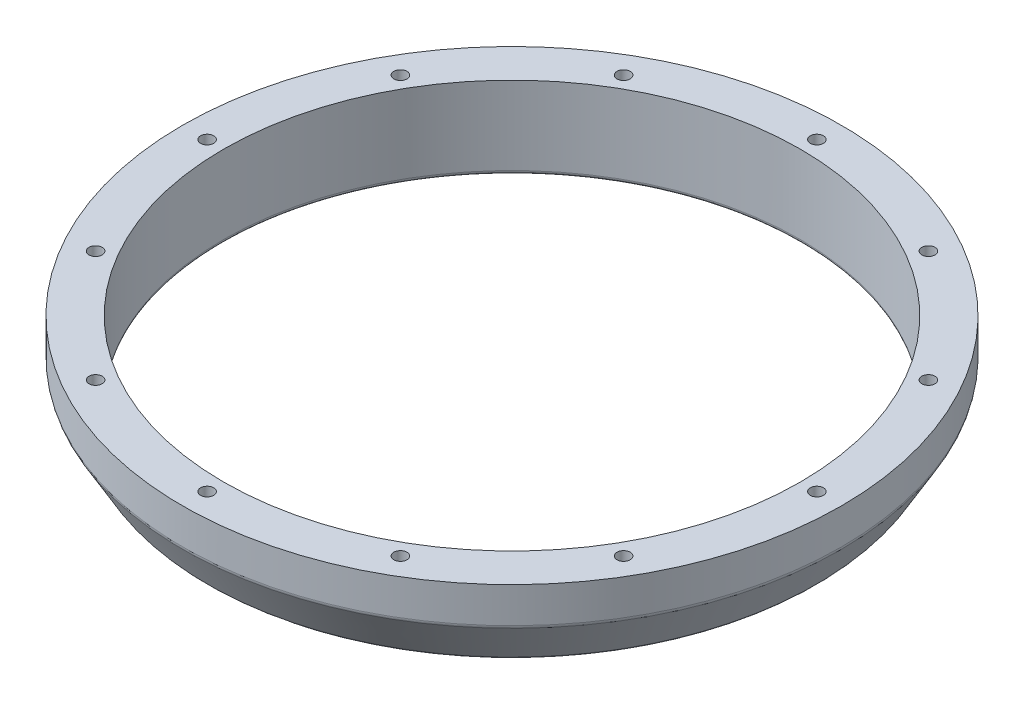
ISO-10303-21;
HEADER;
FILE_DESCRIPTION(('STEP AP214'),'2;1');
FILE_NAME('part.step','',(''),(''),'','','');
FILE_SCHEMA(('AUTOMOTIVE_DESIGN { 1 0 10303 214 1 1 1 1 }'));
ENDSEC;
DATA;
#1=APPLICATION_CONTEXT('core data for automotive mechanical design processes');
#2=APPLICATION_PROTOCOL_DEFINITION('international standard','automotive_design',2000,#1);
#3=PRODUCT_CONTEXT('',#1,'mechanical');
#4=PRODUCT('Part','Part','',(#3));
#5=PRODUCT_RELATED_PRODUCT_CATEGORY('part','',(#4));
#6=PRODUCT_DEFINITION_FORMATION('','',#4);
#7=PRODUCT_DEFINITION_CONTEXT('part definition',#1,'design');
#8=PRODUCT_DEFINITION('design','',#6,#7);
#9=PRODUCT_DEFINITION_SHAPE('','',#8);
#10=(LENGTH_UNIT() NAMED_UNIT(*) SI_UNIT(.MILLI.,.METRE.));
#11=(NAMED_UNIT(*) PLANE_ANGLE_UNIT() SI_UNIT($,.RADIAN.));
#12=(NAMED_UNIT(*) SI_UNIT($,.STERADIAN.) SOLID_ANGLE_UNIT());
#13=UNCERTAINTY_MEASURE_WITH_UNIT(LENGTH_MEASURE(1.E-05),#10,'distance_accuracy_value','');
#14=(GEOMETRIC_REPRESENTATION_CONTEXT(3) GLOBAL_UNCERTAINTY_ASSIGNED_CONTEXT((#13)) GLOBAL_UNIT_ASSIGNED_CONTEXT((#10,
#11,#12)) REPRESENTATION_CONTEXT('',''));
#15=CARTESIAN_POINT('',(0.,0.,0.));
#16=DIRECTION('',(0.,0.,1.));
#17=DIRECTION('',(1.,0.,0.));
#18=AXIS2_PLACEMENT_3D('',#15,#16,#17);
#19=CARTESIAN_POINT('',(-32.04293994002,5.275447721999,-18.5));
#20=DIRECTION('',(0.,1.,0.));
#21=DIRECTION('',(1.,0.,0.));
#22=AXIS2_PLACEMENT_3D('',#19,#20,#21);
#23=CONICAL_SURFACE('',#22,0.458421992183,1.02974425867665);
#24=DIRECTION('',(-0.857167300702112,0.515038074910054,0.));
#25=VECTOR('',#24,1.);
#26=CARTESIAN_POINT('',(-32.501361932203,5.275447721999,-18.5));
#27=LINE('',#26,#25);
#28=CARTESIAN_POINT('',(-32.04293994002,5.,-18.5));
#29=VERTEX_POINT('',#28);
#30=CARTESIAN_POINT('',(-32.84293994002,5.480688495222,-18.5));
#31=VERTEX_POINT('',#30);
#32=EDGE_CURVE('E11',#29,#31,#27,.T.);
#33=ORIENTED_EDGE('',*,*,#32,.T.);
#34=CARTESIAN_POINT('',(-32.04293994002,5.480688495222,-18.5));
#35=DIRECTION('',(0.,1.,0.));
#36=DIRECTION('',(1.,0.,0.));
#37=AXIS2_PLACEMENT_3D('',#34,#35,#36);
#38=CIRCLE('',#37,0.8);
#39=EDGE_CURVE('E316',#31,#31,#38,.T.);
#40=ORIENTED_EDGE('',*,*,#39,.T.);
#41=ORIENTED_EDGE('',*,*,#32,.F.);
#42=EDGE_LOOP('',(#33,#40,#41));
#43=FACE_BOUND('',#42,.T.);
#44=ADVANCED_FACE('F17',(#43),#23,.F.);
#45=CARTESIAN_POINT('',(-32.04293994002,4.75,-18.5));
#46=DIRECTION('',(0.,1.,0.));
#47=DIRECTION('',(1.,0.,0.));
#48=AXIS2_PLACEMENT_3D('',#45,#46,#47);
#49=CYLINDRICAL_SURFACE('',#48,0.8);
#50=ORIENTED_EDGE('',*,*,#39,.F.);
#51=DIRECTION('',(0.,1.,0.));
#52=VECTOR('',#51,1.);
#53=CARTESIAN_POINT('',(-32.84293994002,4.75,-18.5));
#54=LINE('',#53,#52);
#55=CARTESIAN_POINT('',(-32.84293994002,10.,-18.5));
#56=VERTEX_POINT('',#55);
#57=EDGE_CURVE('E28',#31,#56,#54,.T.);
#58=ORIENTED_EDGE('',*,*,#57,.T.);
#59=CARTESIAN_POINT('',(-32.04293994002,10.,-18.5));
#60=DIRECTION('',(0.,1.,0.));
#61=DIRECTION('',(1.,0.,0.));
#62=AXIS2_PLACEMENT_3D('',#59,#60,#61);
#63=CIRCLE('',#62,0.8);
#64=EDGE_CURVE('E21',#56,#56,#63,.T.);
#65=ORIENTED_EDGE('',*,*,#64,.T.);
#66=ORIENTED_EDGE('',*,*,#57,.F.);
#67=EDGE_LOOP('',(#50,#58,#65,#66));
#68=FACE_BOUND('',#67,.T.);
#69=ADVANCED_FACE('F383',(#68),#49,.F.);
#70=CARTESIAN_POINT('',(-18.5,5.275447721999,-32.04293994002));
#71=DIRECTION('',(0.,1.,0.));
#72=DIRECTION('',(1.,0.,0.));
#73=AXIS2_PLACEMENT_3D('',#70,#71,#72);
#74=CONICAL_SURFACE('',#73,0.458421992183,1.02974425867665);
#75=DIRECTION('',(-0.857167300702112,0.515038074910054,0.));
#76=VECTOR('',#75,1.);
#77=CARTESIAN_POINT('',(-18.958421992183,5.275447721999,-32.04293994002));
#78=LINE('',#77,#76);
#79=CARTESIAN_POINT('',(-18.5,5.,-32.04293994002));
#80=VERTEX_POINT('',#79);
#81=CARTESIAN_POINT('',(-19.3,5.480688495222,-32.04293994002));
#82=VERTEX_POINT('',#81);
#83=EDGE_CURVE('E313',#80,#82,#78,.T.);
#84=ORIENTED_EDGE('',*,*,#83,.T.);
#85=CARTESIAN_POINT('',(-18.5,5.480688495222,-32.04293994002));
#86=DIRECTION('',(0.,1.,0.));
#87=DIRECTION('',(1.,0.,0.));
#88=AXIS2_PLACEMENT_3D('',#85,#86,#87);
#89=CIRCLE('',#88,0.8);
#90=EDGE_CURVE('E359',#82,#82,#89,.T.);
#91=ORIENTED_EDGE('',*,*,#90,.T.);
#92=ORIENTED_EDGE('',*,*,#83,.F.);
#93=EDGE_LOOP('',(#84,#91,#92));
#94=FACE_BOUND('',#93,.T.);
#95=ADVANCED_FACE('F482',(#94),#74,.F.);
#96=CARTESIAN_POINT('',(-18.5,4.75,-32.04293994002));
#97=DIRECTION('',(0.,1.,0.));
#98=DIRECTION('',(1.,0.,0.));
#99=AXIS2_PLACEMENT_3D('',#96,#97,#98);
#100=CYLINDRICAL_SURFACE('',#99,0.8);
#101=ORIENTED_EDGE('',*,*,#90,.F.);
#102=DIRECTION('',(0.,1.,0.));
#103=VECTOR('',#102,1.);
#104=CARTESIAN_POINT('',(-19.3,4.75,-32.04293994002));
#105=LINE('',#104,#103);
#106=CARTESIAN_POINT('',(-19.3,10.,-32.04293994002));
#107=VERTEX_POINT('',#106);
#108=EDGE_CURVE('E317',#82,#107,#105,.T.);
#109=ORIENTED_EDGE('',*,*,#108,.T.);
#110=CARTESIAN_POINT('',(-18.5,10.,-32.04293994002));
#111=DIRECTION('',(0.,1.,0.));
#112=DIRECTION('',(1.,0.,0.));
#113=AXIS2_PLACEMENT_3D('',#110,#111,#112);
#114=CIRCLE('',#113,0.8);
#115=EDGE_CURVE('E318',#107,#107,#114,.T.);
#116=ORIENTED_EDGE('',*,*,#115,.T.);
#117=ORIENTED_EDGE('',*,*,#108,.F.);
#118=EDGE_LOOP('',(#101,#109,#116,#117));
#119=FACE_BOUND('',#118,.T.);
#120=ADVANCED_FACE('F545',(#119),#100,.F.);
#121=CARTESIAN_POINT('',(0.,5.275447721999,-37.));
#122=DIRECTION('',(0.,1.,0.));
#123=DIRECTION('',(1.,0.,0.));
#124=AXIS2_PLACEMENT_3D('',#121,#122,#123);
#125=CONICAL_SURFACE('',#124,0.458421992183,1.02974425867665);
#126=DIRECTION('',(-0.857167300702112,0.515038074910054,0.));
#127=VECTOR('',#126,1.);
#128=CARTESIAN_POINT('',(-0.458421992183,5.275447721999,-37.));
#129=LINE('',#128,#127);
#130=CARTESIAN_POINT('',(0.,5.,-37.));
#131=VERTEX_POINT('',#130);
#132=CARTESIAN_POINT('',(-0.8,5.480688495222,-37.));
#133=VERTEX_POINT('',#132);
#134=EDGE_CURVE('E367',#131,#133,#129,.T.);
#135=ORIENTED_EDGE('',*,*,#134,.T.);
#136=CARTESIAN_POINT('',(0.,5.480688495222,-37.));
#137=DIRECTION('',(0.,1.,0.));
#138=DIRECTION('',(1.,0.,0.));
#139=AXIS2_PLACEMENT_3D('',#136,#137,#138);
#140=CIRCLE('',#139,0.8);
#141=EDGE_CURVE('E505',#133,#133,#140,.T.);
#142=ORIENTED_EDGE('',*,*,#141,.T.);
#143=ORIENTED_EDGE('',*,*,#134,.F.);
#144=EDGE_LOOP('',(#135,#142,#143));
#145=FACE_BOUND('',#144,.T.);
#146=ADVANCED_FACE('F498',(#145),#125,.F.);
#147=CARTESIAN_POINT('',(0.,4.75,-37.));
#148=DIRECTION('',(0.,1.,0.));
#149=DIRECTION('',(1.,0.,0.));
#150=AXIS2_PLACEMENT_3D('',#147,#148,#149);
#151=CYLINDRICAL_SURFACE('',#150,0.8);
#152=ORIENTED_EDGE('',*,*,#141,.F.);
#153=DIRECTION('',(0.,1.,0.));
#154=VECTOR('',#153,1.);
#155=CARTESIAN_POINT('',(-0.8,4.75,-37.));
#156=LINE('',#155,#154);
#157=CARTESIAN_POINT('',(-0.8,10.,-37.));
#158=VERTEX_POINT('',#157);
#159=EDGE_CURVE('E373',#133,#158,#156,.T.);
#160=ORIENTED_EDGE('',*,*,#159,.T.);
#161=CARTESIAN_POINT('',(0.,10.,-37.));
#162=DIRECTION('',(0.,1.,0.));
#163=DIRECTION('',(1.,0.,0.));
#164=AXIS2_PLACEMENT_3D('',#161,#162,#163);
#165=CIRCLE('',#164,0.8);
#166=EDGE_CURVE('E260',#158,#158,#165,.T.);
#167=ORIENTED_EDGE('',*,*,#166,.T.);
#168=ORIENTED_EDGE('',*,*,#159,.F.);
#169=EDGE_LOOP('',(#152,#160,#167,#168));
#170=FACE_BOUND('',#169,.T.);
#171=ADVANCED_FACE('F490',(#170),#151,.F.);
#172=CARTESIAN_POINT('',(18.5,5.275447721999,-32.04293994002));
#173=DIRECTION('',(0.,1.,0.));
#174=DIRECTION('',(1.,0.,0.));
#175=AXIS2_PLACEMENT_3D('',#172,#173,#174);
#176=CONICAL_SURFACE('',#175,0.458421992183,1.02974425867665);
#177=DIRECTION('',(-0.857167300702112,0.515038074910054,0.));
#178=VECTOR('',#177,1.);
#179=CARTESIAN_POINT('',(18.041578007817,5.275447721999,-32.04293994002));
#180=LINE('',#179,#178);
#181=CARTESIAN_POINT('',(18.5,5.,-32.04293994002));
#182=VERTEX_POINT('',#181);
#183=CARTESIAN_POINT('',(17.7,5.480688495222,-32.04293994002));
#184=VERTEX_POINT('',#183);
#185=EDGE_CURVE('E338',#182,#184,#180,.T.);
#186=ORIENTED_EDGE('',*,*,#185,.T.);
#187=CARTESIAN_POINT('',(18.5,5.480688495222,-32.04293994002));
#188=DIRECTION('',(0.,1.,0.));
#189=DIRECTION('',(1.,0.,0.));
#190=AXIS2_PLACEMENT_3D('',#187,#188,#189);
#191=CIRCLE('',#190,0.8);
#192=EDGE_CURVE('E339',#184,#184,#191,.T.);
#193=ORIENTED_EDGE('',*,*,#192,.T.);
#194=ORIENTED_EDGE('',*,*,#185,.F.);
#195=EDGE_LOOP('',(#186,#193,#194));
#196=FACE_BOUND('',#195,.T.);
#197=ADVANCED_FACE('F487',(#196),#176,.F.);
#198=CARTESIAN_POINT('',(18.5,4.75,-32.04293994002));
#199=DIRECTION('',(0.,1.,0.));
#200=DIRECTION('',(1.,0.,0.));
#201=AXIS2_PLACEMENT_3D('',#198,#199,#200);
#202=CYLINDRICAL_SURFACE('',#201,0.8);
#203=ORIENTED_EDGE('',*,*,#192,.F.);
#204=DIRECTION('',(0.,1.,0.));
#205=VECTOR('',#204,1.);
#206=CARTESIAN_POINT('',(17.7,4.75,-32.04293994002));
#207=LINE('',#206,#205);
#208=CARTESIAN_POINT('',(17.7,10.,-32.04293994002));
#209=VERTEX_POINT('',#208);
#210=EDGE_CURVE('E335',#184,#209,#207,.T.);
#211=ORIENTED_EDGE('',*,*,#210,.T.);
#212=CARTESIAN_POINT('',(18.5,10.,-32.04293994002));
#213=DIRECTION('',(0.,1.,0.));
#214=DIRECTION('',(1.,0.,0.));
#215=AXIS2_PLACEMENT_3D('',#212,#213,#214);
#216=CIRCLE('',#215,0.8);
#217=EDGE_CURVE('E256',#209,#209,#216,.T.);
#218=ORIENTED_EDGE('',*,*,#217,.T.);
#219=ORIENTED_EDGE('',*,*,#210,.F.);
#220=EDGE_LOOP('',(#203,#211,#218,#219));
#221=FACE_BOUND('',#220,.T.);
#222=ADVANCED_FACE('F489',(#221),#202,.F.);
#223=CARTESIAN_POINT('',(32.04293994002,5.275447721999,-18.5));
#224=DIRECTION('',(0.,1.,0.));
#225=DIRECTION('',(1.,0.,0.));
#226=AXIS2_PLACEMENT_3D('',#223,#224,#225);
#227=CONICAL_SURFACE('',#226,0.458421992183,1.02974425867665);
#228=DIRECTION('',(-0.857167300702112,0.515038074910054,0.));
#229=VECTOR('',#228,1.);
#230=CARTESIAN_POINT('',(31.584517947837,5.275447721999,-18.5));
#231=LINE('',#230,#229);
#232=CARTESIAN_POINT('',(32.04293994002,5.,-18.5));
#233=VERTEX_POINT('',#232);
#234=CARTESIAN_POINT('',(31.24293994002,5.480688495222,-18.5));
#235=VERTEX_POINT('',#234);
#236=EDGE_CURVE('E342',#233,#235,#231,.T.);
#237=ORIENTED_EDGE('',*,*,#236,.T.);
#238=CARTESIAN_POINT('',(32.04293994002,5.480688495222,-18.5));
#239=DIRECTION('',(0.,1.,0.));
#240=DIRECTION('',(1.,0.,0.));
#241=AXIS2_PLACEMENT_3D('',#238,#239,#240);
#242=CIRCLE('',#241,0.8);
#243=EDGE_CURVE('E343',#235,#235,#242,.T.);
#244=ORIENTED_EDGE('',*,*,#243,.T.);
#245=ORIENTED_EDGE('',*,*,#236,.F.);
#246=EDGE_LOOP('',(#237,#244,#245));
#247=FACE_BOUND('',#246,.T.);
#248=ADVANCED_FACE('F485',(#247),#227,.F.);
#249=CARTESIAN_POINT('',(32.04293994002,4.75,-18.5));
#250=DIRECTION('',(0.,1.,0.));
#251=DIRECTION('',(1.,0.,0.));
#252=AXIS2_PLACEMENT_3D('',#249,#250,#251);
#253=CYLINDRICAL_SURFACE('',#252,0.8);
#254=ORIENTED_EDGE('',*,*,#243,.F.);
#255=DIRECTION('',(0.,1.,0.));
#256=VECTOR('',#255,1.);
#257=CARTESIAN_POINT('',(31.24293994002,4.75,-18.5));
#258=LINE('',#257,#256);
#259=CARTESIAN_POINT('',(31.24293994002,10.,-18.5));
#260=VERTEX_POINT('',#259);
#261=EDGE_CURVE('E340',#235,#260,#258,.T.);
#262=ORIENTED_EDGE('',*,*,#261,.T.);
#263=CARTESIAN_POINT('',(32.04293994002,10.,-18.5));
#264=DIRECTION('',(0.,1.,0.));
#265=DIRECTION('',(1.,0.,0.));
#266=AXIS2_PLACEMENT_3D('',#263,#264,#265);
#267=CIRCLE('',#266,0.8);
#268=EDGE_CURVE('E261',#260,#260,#267,.T.);
#269=ORIENTED_EDGE('',*,*,#268,.T.);
#270=ORIENTED_EDGE('',*,*,#261,.F.);
#271=EDGE_LOOP('',(#254,#262,#269,#270));
#272=FACE_BOUND('',#271,.T.);
#273=ADVANCED_FACE('F580',(#272),#253,.F.);
#274=CARTESIAN_POINT('',(37.,5.275447721999,0.));
#275=DIRECTION('',(0.,1.,0.));
#276=DIRECTION('',(1.,0.,0.));
#277=AXIS2_PLACEMENT_3D('',#274,#275,#276);
#278=CONICAL_SURFACE('',#277,0.458421992183,1.02974425867665);
#279=DIRECTION('',(-0.857167300702112,0.515038074910054,0.));
#280=VECTOR('',#279,1.);
#281=CARTESIAN_POINT('',(36.541578007817,5.275447721999,0.));
#282=LINE('',#281,#280);
#283=CARTESIAN_POINT('',(37.,5.,0.));
#284=VERTEX_POINT('',#283);
#285=CARTESIAN_POINT('',(36.2,5.480688495222,0.));
#286=VERTEX_POINT('',#285);
#287=EDGE_CURVE('E435',#284,#286,#282,.T.);
#288=ORIENTED_EDGE('',*,*,#287,.T.);
#289=CARTESIAN_POINT('',(37.,5.480688495222,0.));
#290=DIRECTION('',(0.,1.,0.));
#291=DIRECTION('',(1.,0.,0.));
#292=AXIS2_PLACEMENT_3D('',#289,#290,#291);
#293=CIRCLE('',#292,0.8);
#294=EDGE_CURVE('E417',#286,#286,#293,.T.);
#295=ORIENTED_EDGE('',*,*,#294,.T.);
#296=ORIENTED_EDGE('',*,*,#287,.F.);
#297=EDGE_LOOP('',(#288,#295,#296));
#298=FACE_BOUND('',#297,.T.);
#299=ADVANCED_FACE('F537',(#298),#278,.F.);
#300=CARTESIAN_POINT('',(37.,4.75,0.));
#301=DIRECTION('',(0.,1.,0.));
#302=DIRECTION('',(1.,0.,0.));
#303=AXIS2_PLACEMENT_3D('',#300,#301,#302);
#304=CYLINDRICAL_SURFACE('',#303,0.8);
#305=ORIENTED_EDGE('',*,*,#294,.F.);
#306=DIRECTION('',(0.,1.,0.));
#307=VECTOR('',#306,1.);
#308=CARTESIAN_POINT('',(36.2,4.75,0.));
#309=LINE('',#308,#307);
#310=CARTESIAN_POINT('',(36.2,10.,0.));
#311=VERTEX_POINT('',#310);
#312=EDGE_CURVE('E421',#286,#311,#309,.T.);
#313=ORIENTED_EDGE('',*,*,#312,.T.);
#314=CARTESIAN_POINT('',(37.,10.,0.));
#315=DIRECTION('',(0.,1.,0.));
#316=DIRECTION('',(1.,0.,0.));
#317=AXIS2_PLACEMENT_3D('',#314,#315,#316);
#318=CIRCLE('',#317,0.8);
#319=EDGE_CURVE('E254',#311,#311,#318,.T.);
#320=ORIENTED_EDGE('',*,*,#319,.T.);
#321=ORIENTED_EDGE('',*,*,#312,.F.);
#322=EDGE_LOOP('',(#305,#313,#320,#321));
#323=FACE_BOUND('',#322,.T.);
#324=ADVANCED_FACE('F556',(#323),#304,.F.);
#325=CARTESIAN_POINT('',(32.04293994002,5.275447721999,18.5));
#326=DIRECTION('',(0.,1.,0.));
#327=DIRECTION('',(1.,0.,0.));
#328=AXIS2_PLACEMENT_3D('',#325,#326,#327);
#329=CONICAL_SURFACE('',#328,0.458421992183,1.02974425867665);
#330=DIRECTION('',(-0.857167300702112,0.515038074910054,0.));
#331=VECTOR('',#330,1.);
#332=CARTESIAN_POINT('',(31.584517947837,5.275447721999,18.5));
#333=LINE('',#332,#331);
#334=CARTESIAN_POINT('',(32.04293994002,5.,18.5));
#335=VERTEX_POINT('',#334);
#336=CARTESIAN_POINT('',(31.24293994002,5.480688495222,18.5));
#337=VERTEX_POINT('',#336);
#338=EDGE_CURVE('E422',#335,#337,#333,.T.);
#339=ORIENTED_EDGE('',*,*,#338,.T.);
#340=CARTESIAN_POINT('',(32.04293994002,5.480688495222,18.5));
#341=DIRECTION('',(0.,1.,0.));
#342=DIRECTION('',(1.,0.,0.));
#343=AXIS2_PLACEMENT_3D('',#340,#341,#342);
#344=CIRCLE('',#343,0.8);
#345=EDGE_CURVE('E306',#337,#337,#344,.T.);
#346=ORIENTED_EDGE('',*,*,#345,.T.);
#347=ORIENTED_EDGE('',*,*,#338,.F.);
#348=EDGE_LOOP('',(#339,#346,#347));
#349=FACE_BOUND('',#348,.T.);
#350=ADVANCED_FACE('F552',(#349),#329,.F.);
#351=CARTESIAN_POINT('',(32.04293994002,4.75,18.5));
#352=DIRECTION('',(0.,1.,0.));
#353=DIRECTION('',(1.,0.,0.));
#354=AXIS2_PLACEMENT_3D('',#351,#352,#353);
#355=CYLINDRICAL_SURFACE('',#354,0.8);
#356=ORIENTED_EDGE('',*,*,#345,.F.);
#357=DIRECTION('',(0.,1.,0.));
#358=VECTOR('',#357,1.);
#359=CARTESIAN_POINT('',(31.24293994002,4.75,18.5));
#360=LINE('',#359,#358);
#361=CARTESIAN_POINT('',(31.24293994002,10.,18.5));
#362=VERTEX_POINT('',#361);
#363=EDGE_CURVE('E440',#337,#362,#360,.T.);
#364=ORIENTED_EDGE('',*,*,#363,.T.);
#365=CARTESIAN_POINT('',(32.04293994002,10.,18.5));
#366=DIRECTION('',(0.,1.,0.));
#367=DIRECTION('',(1.,0.,0.));
#368=AXIS2_PLACEMENT_3D('',#365,#366,#367);
#369=CIRCLE('',#368,0.8);
#370=EDGE_CURVE('E250',#362,#362,#369,.T.);
#371=ORIENTED_EDGE('',*,*,#370,.T.);
#372=ORIENTED_EDGE('',*,*,#363,.F.);
#373=EDGE_LOOP('',(#356,#364,#371,#372));
#374=FACE_BOUND('',#373,.T.);
#375=ADVANCED_FACE('F555',(#374),#355,.F.);
#376=CARTESIAN_POINT('',(18.5,5.275447721999,32.04293994002));
#377=DIRECTION('',(0.,1.,0.));
#378=DIRECTION('',(1.,0.,0.));
#379=AXIS2_PLACEMENT_3D('',#376,#377,#378);
#380=CONICAL_SURFACE('',#379,0.458421992183,1.02974425867665);
#381=DIRECTION('',(-0.857167300702112,0.515038074910054,0.));
#382=VECTOR('',#381,1.);
#383=CARTESIAN_POINT('',(18.041578007817,5.275447721999,32.04293994002));
#384=LINE('',#383,#382);
#385=CARTESIAN_POINT('',(18.5,5.,32.04293994002));
#386=VERTEX_POINT('',#385);
#387=CARTESIAN_POINT('',(17.7,5.480688495222,32.04293994002));
#388=VERTEX_POINT('',#387);
#389=EDGE_CURVE('E303',#386,#388,#384,.T.);
#390=ORIENTED_EDGE('',*,*,#389,.T.);
#391=CARTESIAN_POINT('',(18.5,5.480688495222,32.04293994002));
#392=DIRECTION('',(0.,1.,0.));
#393=DIRECTION('',(1.,0.,0.));
#394=AXIS2_PLACEMENT_3D('',#391,#392,#393);
#395=CIRCLE('',#394,0.8);
#396=EDGE_CURVE('E230',#388,#388,#395,.T.);
#397=ORIENTED_EDGE('',*,*,#396,.T.);
#398=ORIENTED_EDGE('',*,*,#389,.F.);
#399=EDGE_LOOP('',(#390,#397,#398));
#400=FACE_BOUND('',#399,.T.);
#401=ADVANCED_FACE('F558',(#400),#380,.F.);
#402=CARTESIAN_POINT('',(18.5,4.75,32.04293994002));
#403=DIRECTION('',(0.,1.,0.));
#404=DIRECTION('',(1.,0.,0.));
#405=AXIS2_PLACEMENT_3D('',#402,#403,#404);
#406=CYLINDRICAL_SURFACE('',#405,0.8);
#407=ORIENTED_EDGE('',*,*,#396,.F.);
#408=DIRECTION('',(0.,1.,0.));
#409=VECTOR('',#408,1.);
#410=CARTESIAN_POINT('',(17.7,4.75,32.04293994002));
#411=LINE('',#410,#409);
#412=CARTESIAN_POINT('',(17.7,10.,32.04293994002));
#413=VERTEX_POINT('',#412);
#414=EDGE_CURVE('E307',#388,#413,#411,.T.);
#415=ORIENTED_EDGE('',*,*,#414,.T.);
#416=CARTESIAN_POINT('',(18.5,10.,32.04293994002));
#417=DIRECTION('',(0.,1.,0.));
#418=DIRECTION('',(1.,0.,0.));
#419=AXIS2_PLACEMENT_3D('',#416,#417,#418);
#420=CIRCLE('',#419,0.8);
#421=EDGE_CURVE('E255',#413,#413,#420,.T.);
#422=ORIENTED_EDGE('',*,*,#421,.T.);
#423=ORIENTED_EDGE('',*,*,#414,.F.);
#424=EDGE_LOOP('',(#407,#415,#422,#423));
#425=FACE_BOUND('',#424,.T.);
#426=ADVANCED_FACE('F561',(#425),#406,.F.);
#427=CARTESIAN_POINT('',(0.,5.275447721999,37.));
#428=DIRECTION('',(0.,1.,0.));
#429=DIRECTION('',(1.,0.,0.));
#430=AXIS2_PLACEMENT_3D('',#427,#428,#429);
#431=CONICAL_SURFACE('',#430,0.458421992183,1.02974425867665);
#432=DIRECTION('',(-0.857167300702112,0.515038074910054,0.));
#433=VECTOR('',#432,1.);
#434=CARTESIAN_POINT('',(-0.458421992183,5.275447721999,37.));
#435=LINE('',#434,#433);
#436=CARTESIAN_POINT('',(0.,5.,37.));
#437=VERTEX_POINT('',#436);
#438=CARTESIAN_POINT('',(-0.8,5.480688495222,37.));
#439=VERTEX_POINT('',#438);
#440=EDGE_CURVE('E224',#437,#439,#435,.T.);
#441=ORIENTED_EDGE('',*,*,#440,.T.);
#442=CARTESIAN_POINT('',(0.,5.480688495222,37.));
#443=DIRECTION('',(0.,1.,0.));
#444=DIRECTION('',(1.,0.,0.));
#445=AXIS2_PLACEMENT_3D('',#442,#443,#444);
#446=CIRCLE('',#445,0.8);
#447=EDGE_CURVE('E228',#439,#439,#446,.T.);
#448=ORIENTED_EDGE('',*,*,#447,.T.);
#449=ORIENTED_EDGE('',*,*,#440,.F.);
#450=EDGE_LOOP('',(#441,#448,#449));
#451=FACE_BOUND('',#450,.T.);
#452=ADVANCED_FACE('F226',(#451),#431,.F.);
#453=CARTESIAN_POINT('',(0.,4.75,37.));
#454=DIRECTION('',(0.,1.,0.));
#455=DIRECTION('',(1.,0.,0.));
#456=AXIS2_PLACEMENT_3D('',#453,#454,#455);
#457=CYLINDRICAL_SURFACE('',#456,0.8);
#458=ORIENTED_EDGE('',*,*,#447,.F.);
#459=DIRECTION('',(0.,1.,0.));
#460=VECTOR('',#459,1.);
#461=CARTESIAN_POINT('',(-0.8,4.75,37.));
#462=LINE('',#461,#460);
#463=CARTESIAN_POINT('',(-0.8,10.,37.));
#464=VERTEX_POINT('',#463);
#465=EDGE_CURVE('E231',#439,#464,#462,.T.);
#466=ORIENTED_EDGE('',*,*,#465,.T.);
#467=CARTESIAN_POINT('',(0.,10.,37.));
#468=DIRECTION('',(0.,1.,0.));
#469=DIRECTION('',(1.,0.,0.));
#470=AXIS2_PLACEMENT_3D('',#467,#468,#469);
#471=CIRCLE('',#470,0.8);
#472=EDGE_CURVE('E237',#464,#464,#471,.T.);
#473=ORIENTED_EDGE('',*,*,#472,.T.);
#474=ORIENTED_EDGE('',*,*,#465,.F.);
#475=EDGE_LOOP('',(#458,#466,#473,#474));
#476=FACE_BOUND('',#475,.T.);
#477=ADVANCED_FACE('F235',(#476),#457,.F.);
#478=CARTESIAN_POINT('',(-18.5,5.275447721999,32.04293994002));
#479=DIRECTION('',(0.,1.,0.));
#480=DIRECTION('',(1.,0.,0.));
#481=AXIS2_PLACEMENT_3D('',#478,#479,#480);
#482=CONICAL_SURFACE('',#481,0.458421992183,1.02974425867665);
#483=DIRECTION('',(-0.857167300702112,0.515038074910054,0.));
#484=VECTOR('',#483,1.);
#485=CARTESIAN_POINT('',(-18.958421992183,5.275447721999,32.04293994002));
#486=LINE('',#485,#484);
#487=CARTESIAN_POINT('',(-18.5,5.,32.04293994002));
#488=VERTEX_POINT('',#487);
#489=CARTESIAN_POINT('',(-19.3,5.480688495222,32.04293994002));
#490=VERTEX_POINT('',#489);
#491=EDGE_CURVE('E244',#488,#490,#486,.T.);
#492=ORIENTED_EDGE('',*,*,#491,.T.);
#493=CARTESIAN_POINT('',(-18.5,5.480688495222,32.04293994002));
#494=DIRECTION('',(0.,1.,0.));
#495=DIRECTION('',(1.,0.,0.));
#496=AXIS2_PLACEMENT_3D('',#493,#494,#495);
#497=CIRCLE('',#496,0.8);
#498=EDGE_CURVE('E262',#490,#490,#497,.T.);
#499=ORIENTED_EDGE('',*,*,#498,.T.);
#500=ORIENTED_EDGE('',*,*,#491,.F.);
#501=EDGE_LOOP('',(#492,#499,#500));
#502=FACE_BOUND('',#501,.T.);
#503=ADVANCED_FACE('F565',(#502),#482,.F.);
#504=CARTESIAN_POINT('',(-18.5,4.75,32.04293994002));
#505=DIRECTION('',(0.,1.,0.));
#506=DIRECTION('',(1.,0.,0.));
#507=AXIS2_PLACEMENT_3D('',#504,#505,#506);
#508=CYLINDRICAL_SURFACE('',#507,0.8);
#509=ORIENTED_EDGE('',*,*,#498,.F.);
#510=DIRECTION('',(0.,1.,0.));
#511=VECTOR('',#510,1.);
#512=CARTESIAN_POINT('',(-19.3,4.75,32.04293994002));
#513=LINE('',#512,#511);
#514=CARTESIAN_POINT('',(-19.3,10.,32.04293994002));
#515=VERTEX_POINT('',#514);
#516=EDGE_CURVE('E266',#490,#515,#513,.T.);
#517=ORIENTED_EDGE('',*,*,#516,.T.);
#518=CARTESIAN_POINT('',(-18.5,10.,32.04293994002));
#519=DIRECTION('',(0.,1.,0.));
#520=DIRECTION('',(1.,0.,0.));
#521=AXIS2_PLACEMENT_3D('',#518,#519,#520);
#522=CIRCLE('',#521,0.8);
#523=EDGE_CURVE('E279',#515,#515,#522,.T.);
#524=ORIENTED_EDGE('',*,*,#523,.T.);
#525=ORIENTED_EDGE('',*,*,#516,.F.);
#526=EDGE_LOOP('',(#509,#517,#524,#525));
#527=FACE_BOUND('',#526,.T.);
#528=ADVANCED_FACE('F550',(#527),#508,.F.);
#529=CARTESIAN_POINT('',(-32.04293994002,5.275447721999,18.5));
#530=DIRECTION('',(0.,1.,0.));
#531=DIRECTION('',(1.,0.,0.));
#532=AXIS2_PLACEMENT_3D('',#529,#530,#531);
#533=CONICAL_SURFACE('',#532,0.458421992183,1.02974425867665);
#534=DIRECTION('',(-0.857167300702112,0.515038074910054,0.));
#535=VECTOR('',#534,1.);
#536=CARTESIAN_POINT('',(-32.501361932203,5.275447721999,18.5));
#537=LINE('',#536,#535);
#538=CARTESIAN_POINT('',(-32.04293994002,5.,18.5));
#539=VERTEX_POINT('',#538);
#540=CARTESIAN_POINT('',(-32.84293994002,5.480688495222,18.5));
#541=VERTEX_POINT('',#540);
#542=EDGE_CURVE('E267',#539,#541,#537,.T.);
#543=ORIENTED_EDGE('',*,*,#542,.T.);
#544=CARTESIAN_POINT('',(-32.04293994002,5.480688495222,18.5));
#545=DIRECTION('',(0.,1.,0.));
#546=DIRECTION('',(1.,0.,0.));
#547=AXIS2_PLACEMENT_3D('',#544,#545,#546);
#548=CIRCLE('',#547,0.8);
#549=EDGE_CURVE('E322',#541,#541,#548,.T.);
#550=ORIENTED_EDGE('',*,*,#549,.T.);
#551=ORIENTED_EDGE('',*,*,#542,.F.);
#552=EDGE_LOOP('',(#543,#550,#551));
#553=FACE_BOUND('',#552,.T.);
#554=ADVANCED_FACE('F547',(#553),#533,.F.);
#555=CARTESIAN_POINT('',(-32.04293994002,4.75,18.5));
#556=DIRECTION('',(0.,1.,0.));
#557=DIRECTION('',(1.,0.,0.));
#558=AXIS2_PLACEMENT_3D('',#555,#556,#557);
#559=CYLINDRICAL_SURFACE('',#558,0.8);
#560=ORIENTED_EDGE('',*,*,#549,.F.);
#561=DIRECTION('',(0.,1.,0.));
#562=VECTOR('',#561,1.);
#563=CARTESIAN_POINT('',(-32.84293994002,4.75,18.5));
#564=LINE('',#563,#562);
#565=CARTESIAN_POINT('',(-32.84293994002,10.,18.5));
#566=VERTEX_POINT('',#565);
#567=EDGE_CURVE('E326',#541,#566,#564,.T.);
#568=ORIENTED_EDGE('',*,*,#567,.T.);
#569=CARTESIAN_POINT('',(-32.04293994002,10.,18.5));
#570=DIRECTION('',(0.,1.,0.));
#571=DIRECTION('',(1.,0.,0.));
#572=AXIS2_PLACEMENT_3D('',#569,#570,#571);
#573=CIRCLE('',#572,0.8);
#574=EDGE_CURVE('E276',#566,#566,#573,.T.);
#575=ORIENTED_EDGE('',*,*,#574,.T.);
#576=ORIENTED_EDGE('',*,*,#567,.F.);
#577=EDGE_LOOP('',(#560,#568,#575,#576));
#578=FACE_BOUND('',#577,.T.);
#579=ADVANCED_FACE('F19',(#578),#559,.F.);
#580=CARTESIAN_POINT('',(-37.,5.275447721999,0.));
#581=DIRECTION('',(0.,1.,0.));
#582=DIRECTION('',(1.,0.,0.));
#583=AXIS2_PLACEMENT_3D('',#580,#581,#582);
#584=CONICAL_SURFACE('',#583,0.458421992183,1.02974425867665);
#585=DIRECTION('',(-0.857167300702112,0.515038074910054,0.));
#586=VECTOR('',#585,1.);
#587=CARTESIAN_POINT('',(-37.458421992183,5.275447721999,0.));
#588=LINE('',#587,#586);
#589=CARTESIAN_POINT('',(-37.,5.,0.));
#590=VERTEX_POINT('',#589);
#591=CARTESIAN_POINT('',(-37.8,5.480688495222,0.));
#592=VERTEX_POINT('',#591);
#593=EDGE_CURVE('E327',#590,#592,#588,.T.);
#594=ORIENTED_EDGE('',*,*,#593,.T.);
#595=CARTESIAN_POINT('',(-37.,5.480688495222,0.));
#596=DIRECTION('',(0.,1.,0.));
#597=DIRECTION('',(1.,0.,0.));
#598=AXIS2_PLACEMENT_3D('',#595,#596,#597);
#599=CIRCLE('',#598,0.8);
#600=EDGE_CURVE('E388',#592,#592,#599,.T.);
#601=ORIENTED_EDGE('',*,*,#600,.T.);
#602=ORIENTED_EDGE('',*,*,#593,.F.);
#603=EDGE_LOOP('',(#594,#601,#602));
#604=FACE_BOUND('',#603,.T.);
#605=ADVANCED_FACE('F463',(#604),#584,.F.);
#606=CARTESIAN_POINT('',(-37.,4.75,0.));
#607=DIRECTION('',(0.,1.,0.));
#608=DIRECTION('',(1.,0.,0.));
#609=AXIS2_PLACEMENT_3D('',#606,#607,#608);
#610=CYLINDRICAL_SURFACE('',#609,0.8);
#611=ORIENTED_EDGE('',*,*,#600,.F.);
#612=DIRECTION('',(0.,1.,0.));
#613=VECTOR('',#612,1.);
#614=CARTESIAN_POINT('',(-37.8,4.75,0.));
#615=LINE('',#614,#613);
#616=CARTESIAN_POINT('',(-37.8,10.,0.));
#617=VERTEX_POINT('',#616);
#618=EDGE_CURVE('E393',#592,#617,#615,.T.);
#619=ORIENTED_EDGE('',*,*,#618,.T.);
#620=CARTESIAN_POINT('',(-37.,10.,0.));
#621=DIRECTION('',(0.,1.,0.));
#622=DIRECTION('',(1.,0.,0.));
#623=AXIS2_PLACEMENT_3D('',#620,#621,#622);
#624=CIRCLE('',#623,0.8);
#625=EDGE_CURVE('E280',#617,#617,#624,.T.);
#626=ORIENTED_EDGE('',*,*,#625,.T.);
#627=ORIENTED_EDGE('',*,*,#618,.F.);
#628=EDGE_LOOP('',(#611,#619,#626,#627));
#629=FACE_BOUND('',#628,.T.);
#630=ADVANCED_FACE('F464',(#629),#610,.F.);
#631=CARTESIAN_POINT('',(0.,10.,0.));
#632=DIRECTION('',(0.,-1.,0.));
#633=DIRECTION('',(0.,0.,-1.));
#634=AXIS2_PLACEMENT_3D('',#631,#632,#633);
#635=PLANE('',#634);
#636=ORIENTED_EDGE('',*,*,#64,.F.);
#637=EDGE_LOOP('',(#636));
#638=FACE_BOUND('',#637,.T.);
#639=ORIENTED_EDGE('',*,*,#115,.F.);
#640=EDGE_LOOP('',(#639));
#641=FACE_BOUND('',#640,.T.);
#642=ORIENTED_EDGE('',*,*,#166,.F.);
#643=EDGE_LOOP('',(#642));
#644=FACE_BOUND('',#643,.T.);
#645=ORIENTED_EDGE('',*,*,#217,.F.);
#646=EDGE_LOOP('',(#645));
#647=FACE_BOUND('',#646,.T.);
#648=ORIENTED_EDGE('',*,*,#268,.F.);
#649=EDGE_LOOP('',(#648));
#650=FACE_BOUND('',#649,.T.);
#651=ORIENTED_EDGE('',*,*,#319,.F.);
#652=EDGE_LOOP('',(#651));
#653=FACE_BOUND('',#652,.T.);
#654=ORIENTED_EDGE('',*,*,#370,.F.);
#655=EDGE_LOOP('',(#654));
#656=FACE_BOUND('',#655,.T.);
#657=ORIENTED_EDGE('',*,*,#421,.F.);
#658=EDGE_LOOP('',(#657));
#659=FACE_BOUND('',#658,.T.);
#660=ORIENTED_EDGE('',*,*,#472,.F.);
#661=EDGE_LOOP('',(#660));
#662=FACE_BOUND('',#661,.T.);
#663=ORIENTED_EDGE('',*,*,#523,.F.);
#664=EDGE_LOOP('',(#663));
#665=FACE_BOUND('',#664,.T.);
#666=ORIENTED_EDGE('',*,*,#574,.F.);
#667=EDGE_LOOP('',(#666));
#668=FACE_BOUND('',#667,.T.);
#669=ORIENTED_EDGE('',*,*,#625,.F.);
#670=EDGE_LOOP('',(#669));
#671=FACE_BOUND('',#670,.T.);
#672=CARTESIAN_POINT('',(0.,10.,0.));
#673=DIRECTION('',(0.,-1.,0.));
#674=DIRECTION('',(1.,0.,0.));
#675=AXIS2_PLACEMENT_3D('',#672,#673,#674);
#676=CIRCLE('',#675,35.);
#677=CARTESIAN_POINT('',(35.,10.,0.));
#678=VERTEX_POINT('',#677);
#679=EDGE_CURVE('E427',#678,#678,#676,.T.);
#680=ORIENTED_EDGE('',*,*,#679,.T.);
#681=EDGE_LOOP('',(#680));
#682=FACE_BOUND('',#681,.T.);
#683=CARTESIAN_POINT('',(0.,10.,0.));
#684=DIRECTION('',(0.,1.,0.));
#685=DIRECTION('',(1.,0.,0.));
#686=AXIS2_PLACEMENT_3D('',#683,#684,#685);
#687=CIRCLE('',#686,40.);
#688=CARTESIAN_POINT('',(40.,10.,0.));
#689=VERTEX_POINT('',#688);
#690=EDGE_CURVE('E291',#689,#689,#687,.T.);
#691=ORIENTED_EDGE('',*,*,#690,.T.);
#692=EDGE_LOOP('',(#691));
#693=FACE_BOUND('',#692,.T.);
#694=ADVANCED_FACE('F466',(#638,#641,#644,#647,#650,#653,#656,#659,#662,#665,#668,#671,#682,
#693),#635,.F.);
#695=CARTESIAN_POINT('',(0.,10.5,0.));
#696=DIRECTION('',(0.,-1.,0.));
#697=DIRECTION('',(-1.,0.,0.));
#698=AXIS2_PLACEMENT_3D('',#695,#696,#697);
#699=CYLINDRICAL_SURFACE('',#698,40.);
#700=CARTESIAN_POINT('',(0.,5.687564434702,0.));
#701=DIRECTION('',(0.,1.,0.));
#702=DIRECTION('',(1.,0.,0.));
#703=AXIS2_PLACEMENT_3D('',#700,#701,#702);
#704=CIRCLE('',#703,40.);
#705=CARTESIAN_POINT('',(-39.9996474277953,5.687564434702,-0.167945384195082));
#706=VERTEX_POINT('',#705);
#707=CARTESIAN_POINT('',(40.,5.687564434702,0.));
#708=VERTEX_POINT('',#707);
#709=EDGE_CURVE('E348',#706,#708,#704,.T.);
#710=ORIENTED_EDGE('',*,*,#709,.T.);
#711=DIRECTION('',(0.,1.,0.));
#712=VECTOR('',#711,1.);
#713=CARTESIAN_POINT('',(40.,10.5,0.));
#714=LINE('',#713,#712);
#715=EDGE_CURVE('E299',#708,#689,#714,.T.);
#716=ORIENTED_EDGE('',*,*,#715,.T.);
#717=ORIENTED_EDGE('',*,*,#690,.F.);
#718=ORIENTED_EDGE('',*,*,#715,.F.);
#719=CARTESIAN_POINT('',(0.,5.687564434702,0.));
#720=DIRECTION('',(0.,1.,0.));
#721=DIRECTION('',(1.,0.,0.));
#722=AXIS2_PLACEMENT_3D('',#719,#720,#721);
#723=CIRCLE('',#722,40.);
#724=EDGE_CURVE('E334',#708,#706,#723,.T.);
#725=ORIENTED_EDGE('',*,*,#724,.T.);
#726=EDGE_LOOP('',(#710,#716,#717,#718,#725));
#727=FACE_BOUND('',#726,.T.);
#728=ADVANCED_FACE('F473',(#727),#699,.T.);
#729=CARTESIAN_POINT('',(0.,5.687564434702,0.));
#730=DIRECTION('',(0.,-1.,0.));
#731=DIRECTION('',(0.999991185694881,0.,0.00419863460487692));
#732=AXIS2_PLACEMENT_3D('',#729,#730,#731);
#733=TOROIDAL_SURFACE('',#732,39.3,0.7);
#734=CARTESIAN_POINT('',(0.,5.337564434702,0.));
#735=DIRECTION('',(0.,1.,0.));
#736=DIRECTION('',(1.,0.,0.));
#737=AXIS2_PLACEMENT_3D('',#734,#735,#736);
#738=CIRCLE('',#737,39.90621778265);
#739=CARTESIAN_POINT('',(-39.90621778265,5.337564434702,0.));
#740=VERTEX_POINT('',#739);
#741=CARTESIAN_POINT('',(-39.9058660370703,5.337564434702,-0.167551626931994));
#742=VERTEX_POINT('',#741);
#743=EDGE_CURVE('E352',#740,#742,#738,.T.);
#744=ORIENTED_EDGE('',*,*,#743,.T.);
#745=CARTESIAN_POINT('',(-39.2996535978088,5.687564434702,-0.165006339971668));
#746=DIRECTION('',(0.00419863460487704,0.,-0.999991185694881));
#747=DIRECTION('',(-0.999991185694881,0.,-0.00419863460487704));
#748=AXIS2_PLACEMENT_3D('',#745,#746,#747);
#749=CIRCLE('',#748,0.7);
#750=EDGE_CURVE('E330',#742,#706,#749,.T.);
#751=ORIENTED_EDGE('',*,*,#750,.T.);
#752=ORIENTED_EDGE('',*,*,#724,.F.);
#753=ORIENTED_EDGE('',*,*,#709,.F.);
#754=ORIENTED_EDGE('',*,*,#750,.F.);
#755=CARTESIAN_POINT('',(0.,5.337564434702,0.));
#756=DIRECTION('',(0.,1.,0.));
#757=DIRECTION('',(1.,0.,0.));
#758=AXIS2_PLACEMENT_3D('',#755,#756,#757);
#759=CIRCLE('',#758,39.90621778265);
#760=EDGE_CURVE('E248',#742,#740,#759,.T.);
#761=ORIENTED_EDGE('',*,*,#760,.T.);
#762=EDGE_LOOP('',(#744,#751,#752,#753,#754,#761));
#763=FACE_BOUND('',#762,.T.);
#764=ADVANCED_FACE('F528',(#763),#733,.T.);
#765=CARTESIAN_POINT('',(0.,2.793782217351,0.));
#766=DIRECTION('',(0.,1.,0.));
#767=DIRECTION('',(1.,0.,0.));
#768=AXIS2_PLACEMENT_3D('',#765,#766,#767);
#769=CONICAL_SURFACE('',#768,38.4375644347,0.523598775598299);
#770=ORIENTED_EDGE('',*,*,#743,.F.);
#771=DIRECTION('',(0.5,-0.866025403784439,0.));
#772=VECTOR('',#771,1.);
#773=CARTESIAN_POINT('',(-38.4375644347,2.793782217351,0.));
#774=LINE('',#773,#772);
#775=CARTESIAN_POINT('',(-36.96891108675,0.25,0.));
#776=VERTEX_POINT('',#775);
#777=EDGE_CURVE('E349',#740,#776,#774,.T.);
#778=ORIENTED_EDGE('',*,*,#777,.T.);
#779=CARTESIAN_POINT('',(0.,0.25,0.));
#780=DIRECTION('',(0.,1.,0.));
#781=DIRECTION('',(1.,0.,0.));
#782=AXIS2_PLACEMENT_3D('',#779,#780,#781);
#783=CIRCLE('',#782,36.96891108675);
#784=CARTESIAN_POINT('',(-36.9685577373624,0.25,-0.161634647668803));
#785=VERTEX_POINT('',#784);
#786=EDGE_CURVE('E423',#776,#785,#783,.T.);
#787=ORIENTED_EDGE('',*,*,#786,.T.);
#788=CARTESIAN_POINT('',(0.,0.25,0.));
#789=DIRECTION('',(0.,1.,0.));
#790=DIRECTION('',(1.,0.,0.));
#791=AXIS2_PLACEMENT_3D('',#788,#789,#790);
#792=CIRCLE('',#791,36.96891108675);
#793=EDGE_CURVE('E406',#785,#776,#792,.T.);
#794=ORIENTED_EDGE('',*,*,#793,.T.);
#795=ORIENTED_EDGE('',*,*,#777,.F.);
#796=ORIENTED_EDGE('',*,*,#760,.F.);
#797=EDGE_LOOP('',(#770,#778,#787,#794,#795,#796));
#798=FACE_BOUND('',#797,.T.);
#799=ADVANCED_FACE('F533',(#798),#769,.T.);
#800=CARTESIAN_POINT('',(0.,0.5,0.));
#801=DIRECTION('',(0.,-1.,0.));
#802=DIRECTION('',(0.999990441985518,0.,0.00437217767354608));
#803=AXIS2_PLACEMENT_3D('',#800,#801,#802);
#804=TOROIDAL_SURFACE('',#803,36.53589838486,0.5);
#805=CARTESIAN_POINT('',(0.,0.,0.));
#806=DIRECTION('',(0.,1.,0.));
#807=DIRECTION('',(1.,0.,0.));
#808=AXIS2_PLACEMENT_3D('',#805,#806,#807);
#809=CIRCLE('',#808,36.53589838486);
#810=CARTESIAN_POINT('',(-36.5355491742141,0.,-0.159741439201238));
#811=VERTEX_POINT('',#810);
#812=EDGE_CURVE('E271',#811,#811,#809,.T.);
#813=ORIENTED_EDGE('',*,*,#812,.T.);
#814=CARTESIAN_POINT('',(-36.5355491742141,0.5,-0.159741439201238));
#815=DIRECTION('',(0.0043721776735462,0.,-0.999990441985518));
#816=DIRECTION('',(-0.999990441985518,0.,-0.0043721776735462));
#817=AXIS2_PLACEMENT_3D('',#814,#815,#816);
#818=CIRCLE('',#817,0.5);
#819=EDGE_CURVE('E274',#811,#785,#818,.T.);
#820=ORIENTED_EDGE('',*,*,#819,.T.);
#821=ORIENTED_EDGE('',*,*,#786,.F.);
#822=ORIENTED_EDGE('',*,*,#793,.F.);
#823=ORIENTED_EDGE('',*,*,#819,.F.);
#824=EDGE_LOOP('',(#813,#820,#821,#822,#823));
#825=FACE_BOUND('',#824,.T.);
#826=ADVANCED_FACE('F538',(#825),#804,.T.);
#827=CARTESIAN_POINT('',(0.,0.,0.));
#828=DIRECTION('',(0.,-1.,0.));
#829=DIRECTION('',(0.,0.,-1.));
#830=AXIS2_PLACEMENT_3D('',#827,#828,#829);
#831=PLANE('',#830);
#832=CARTESIAN_POINT('',(0.,0.,0.));
#833=DIRECTION('',(0.,1.,0.));
#834=DIRECTION('',(-1.,0.,0.));
#835=AXIS2_PLACEMENT_3D('',#832,#833,#834);
#836=CIRCLE('',#835,35.5);
#837=CARTESIAN_POINT('',(35.499107941842,0.,0.25166512164691));
#838=VERTEX_POINT('',#837);
#839=EDGE_CURVE('E275',#838,#838,#836,.T.);
#840=ORIENTED_EDGE('',*,*,#839,.T.);
#841=EDGE_LOOP('',(#840));
#842=FACE_BOUND('',#841,.T.);
#843=ORIENTED_EDGE('',*,*,#812,.F.);
#844=EDGE_LOOP('',(#843));
#845=FACE_BOUND('',#844,.T.);
#846=ADVANCED_FACE('F541',(#842,#845),#831,.T.);
#847=CARTESIAN_POINT('',(0.,0.5,0.));
#848=DIRECTION('',(0.,-1.,0.));
#849=DIRECTION('',(-0.999974871601182,0.,-0.00708915835625087));
#850=AXIS2_PLACEMENT_3D('',#847,#848,#849);
#851=TOROIDAL_SURFACE('',#850,35.5,0.5);
#852=CARTESIAN_POINT('',(0.,0.5,0.));
#853=DIRECTION('',(0.,1.,0.));
#854=DIRECTION('',(-1.,0.,0.));
#855=AXIS2_PLACEMENT_3D('',#852,#853,#854);
#856=CIRCLE('',#855,35.);
#857=CARTESIAN_POINT('',(35.,0.5,0.));
#858=VERTEX_POINT('',#857);
#859=CARTESIAN_POINT('',(34.9991205060414,0.5,0.248120542468785));
#860=VERTEX_POINT('',#859);
#861=EDGE_CURVE('E312',#858,#860,#856,.T.);
#862=ORIENTED_EDGE('',*,*,#861,.T.);
#863=CARTESIAN_POINT('',(35.499107941842,0.5,0.25166512164691));
#864=DIRECTION('',(-0.00708915835625099,0.,0.999974871601182));
#865=DIRECTION('',(0.999974871601182,0.,0.00708915835625099));
#866=AXIS2_PLACEMENT_3D('',#863,#864,#865);
#867=CIRCLE('',#866,0.5);
#868=EDGE_CURVE('E308',#860,#838,#867,.T.);
#869=ORIENTED_EDGE('',*,*,#868,.T.);
#870=ORIENTED_EDGE('',*,*,#839,.F.);
#871=ORIENTED_EDGE('',*,*,#868,.F.);
#872=CARTESIAN_POINT('',(0.,0.5,0.));
#873=DIRECTION('',(0.,1.,0.));
#874=DIRECTION('',(-1.,0.,0.));
#875=AXIS2_PLACEMENT_3D('',#872,#873,#874);
#876=CIRCLE('',#875,35.);
#877=EDGE_CURVE('E407',#860,#858,#876,.T.);
#878=ORIENTED_EDGE('',*,*,#877,.T.);
#879=EDGE_LOOP('',(#862,#869,#870,#871,#878));
#880=FACE_BOUND('',#879,.T.);
#881=ADVANCED_FACE('F574',(#880),#851,.T.);
#882=CARTESIAN_POINT('',(0.,10.5,0.));
#883=DIRECTION('',(0.,-1.,0.));
#884=DIRECTION('',(-1.,0.,0.));
#885=AXIS2_PLACEMENT_3D('',#882,#883,#884);
#886=CYLINDRICAL_SURFACE('',#885,35.);
#887=ORIENTED_EDGE('',*,*,#679,.F.);
#888=DIRECTION('',(0.,-1.,0.));
#889=VECTOR('',#888,1.);
#890=CARTESIAN_POINT('',(35.,10.5,0.));
#891=LINE('',#890,#889);
#892=EDGE_CURVE('E411',#678,#858,#891,.T.);
#893=ORIENTED_EDGE('',*,*,#892,.T.);
#894=ORIENTED_EDGE('',*,*,#877,.F.);
#895=ORIENTED_EDGE('',*,*,#861,.F.);
#896=ORIENTED_EDGE('',*,*,#892,.F.);
#897=EDGE_LOOP('',(#887,#893,#894,#895,#896));
#898=FACE_BOUND('',#897,.T.);
#899=ADVANCED_FACE('F572',(#898),#886,.F.);
#900=CLOSED_SHELL('',(#44,#69,#95,#120,#146,#171,#197,#222,#248,#273,#299,#324,#350,#375,#401,
#426,#452,#477,#503,#528,#554,#579,#605,#630,#694,#728,#764,#799,#826,#846,#881,#899));
#901=MANIFOLD_SOLID_BREP('B1',#900);
#902=ADVANCED_BREP_SHAPE_REPRESENTATION('',(#18,#901),#14);
#903=SHAPE_DEFINITION_REPRESENTATION(#9,#902);
ENDSEC;
END-ISO-10303-21;
